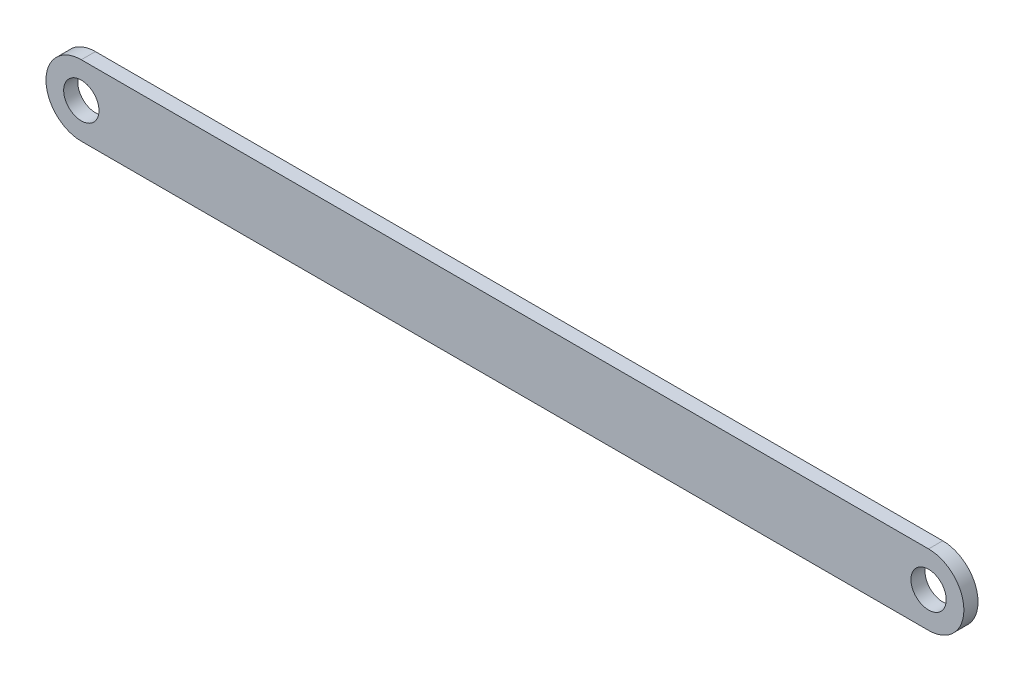
ISO-10303-21;
HEADER;
FILE_DESCRIPTION(('STEP AP214'),'2;1');
FILE_NAME('part.step','',(''),(''),'','','');
FILE_SCHEMA(('AUTOMOTIVE_DESIGN { 1 0 10303 214 1 1 1 1 }'));
ENDSEC;
DATA;
#1=APPLICATION_CONTEXT('core data for automotive mechanical design processes');
#2=APPLICATION_PROTOCOL_DEFINITION('international standard','automotive_design',2000,#1);
#3=PRODUCT_CONTEXT('',#1,'mechanical');
#4=PRODUCT('Part','Part','',(#3));
#5=PRODUCT_RELATED_PRODUCT_CATEGORY('part','',(#4));
#6=PRODUCT_DEFINITION_FORMATION('','',#4);
#7=PRODUCT_DEFINITION_CONTEXT('part definition',#1,'design');
#8=PRODUCT_DEFINITION('design','',#6,#7);
#9=PRODUCT_DEFINITION_SHAPE('','',#8);
#10=(LENGTH_UNIT() NAMED_UNIT(*) SI_UNIT(.MILLI.,.METRE.));
#11=(NAMED_UNIT(*) PLANE_ANGLE_UNIT() SI_UNIT($,.RADIAN.));
#12=(NAMED_UNIT(*) SI_UNIT($,.STERADIAN.) SOLID_ANGLE_UNIT());
#13=UNCERTAINTY_MEASURE_WITH_UNIT(LENGTH_MEASURE(1.E-05),#10,'distance_accuracy_value','');
#14=(GEOMETRIC_REPRESENTATION_CONTEXT(3) GLOBAL_UNCERTAINTY_ASSIGNED_CONTEXT((#13)) GLOBAL_UNIT_ASSIGNED_CONTEXT((#10,
#11,#12)) REPRESENTATION_CONTEXT('',''));
#15=CARTESIAN_POINT('',(0.,0.,0.));
#16=DIRECTION('',(0.,0.,1.));
#17=DIRECTION('',(1.,0.,0.));
#18=AXIS2_PLACEMENT_3D('',#15,#16,#17);
#19=CARTESIAN_POINT('',(-76.2121212121212,5.75757575757577,2.));
#20=DIRECTION('',(0.,0.,1.));
#21=DIRECTION('',(1.,0.,0.));
#22=AXIS2_PLACEMENT_3D('',#19,#20,#21);
#23=PLANE('',#22);
#24=CARTESIAN_POINT('',(-76.2121212121212,5.75757575757577,2.));
#25=DIRECTION('',(0.,0.,1.));
#26=DIRECTION('',(1.,0.,0.));
#27=AXIS2_PLACEMENT_3D('',#24,#25,#26);
#28=CIRCLE('',#27,2.5);
#29=CARTESIAN_POINT('',(-73.7121212121212,5.75757575757577,2.));
#30=VERTEX_POINT('',#29);
#31=EDGE_CURVE('E110',#30,#30,#28,.T.);
#32=ORIENTED_EDGE('',*,*,#31,.F.);
#33=EDGE_LOOP('',(#32));
#34=FACE_BOUND('',#33,.T.);
#35=CARTESIAN_POINT('',(-76.2121212121212,5.75757575757577,2.));
#36=DIRECTION('',(0.,0.,1.));
#37=DIRECTION('',(1.,0.,0.));
#38=AXIS2_PLACEMENT_3D('',#35,#36,#37);
#39=CIRCLE('',#38,5.);
#40=CARTESIAN_POINT('',(-76.2121212121212,10.7575757575758,2.));
#41=VERTEX_POINT('',#40);
#42=CARTESIAN_POINT('',(-76.2121212121212,0.757575757575767,2.));
#43=VERTEX_POINT('',#42);
#44=EDGE_CURVE('E95',#41,#43,#39,.T.);
#45=ORIENTED_EDGE('',*,*,#44,.T.);
#46=DIRECTION('',(1.,0.,0.));
#47=VECTOR('',#46,1.);
#48=CARTESIAN_POINT('',(-76.2121212121212,0.757575757575767,2.));
#49=LINE('',#48,#47);
#50=CARTESIAN_POINT('',(43.7878787878788,0.757575757575765,2.));
#51=VERTEX_POINT('',#50);
#52=EDGE_CURVE('E90',#43,#51,#49,.T.);
#53=ORIENTED_EDGE('',*,*,#52,.T.);
#54=CARTESIAN_POINT('',(43.7878787878788,5.75757575757577,2.));
#55=DIRECTION('',(0.,0.,1.));
#56=DIRECTION('',(1.,0.,0.));
#57=AXIS2_PLACEMENT_3D('',#54,#55,#56);
#58=CIRCLE('',#57,5.);
#59=CARTESIAN_POINT('',(43.7878787878788,10.7575757575758,2.));
#60=VERTEX_POINT('',#59);
#61=EDGE_CURVE('E93',#51,#60,#58,.T.);
#62=ORIENTED_EDGE('',*,*,#61,.T.);
#63=DIRECTION('',(-1.,0.,0.));
#64=VECTOR('',#63,1.);
#65=CARTESIAN_POINT('',(-76.2121212121212,10.7575757575758,2.));
#66=LINE('',#65,#64);
#67=EDGE_CURVE('E60',#60,#41,#66,.T.);
#68=ORIENTED_EDGE('',*,*,#67,.T.);
#69=EDGE_LOOP('',(#45,#53,#62,#68));
#70=FACE_BOUND('',#69,.T.);
#71=CARTESIAN_POINT('',(43.7878787878788,5.75757575757577,2.));
#72=DIRECTION('',(0.,0.,1.));
#73=DIRECTION('',(1.,0.,0.));
#74=AXIS2_PLACEMENT_3D('',#71,#72,#73);
#75=CIRCLE('',#74,2.5);
#76=CARTESIAN_POINT('',(46.2878787878788,5.75757575757577,2.));
#77=VERTEX_POINT('',#76);
#78=EDGE_CURVE('E125',#77,#77,#75,.T.);
#79=ORIENTED_EDGE('',*,*,#78,.F.);
#80=EDGE_LOOP('',(#79));
#81=FACE_BOUND('',#80,.T.);
#82=ADVANCED_FACE('F43',(#34,#70,#81),#23,.T.);
#83=CARTESIAN_POINT('',(-76.2121212121212,5.75757575757577,0.));
#84=DIRECTION('',(0.,0.,1.));
#85=DIRECTION('',(1.,0.,0.));
#86=AXIS2_PLACEMENT_3D('',#83,#84,#85);
#87=PLANE('',#86);
#88=CARTESIAN_POINT('',(-76.2121212121212,5.75757575757577,0.));
#89=DIRECTION('',(0.,0.,1.));
#90=DIRECTION('',(1.,0.,0.));
#91=AXIS2_PLACEMENT_3D('',#88,#89,#90);
#92=CIRCLE('',#91,5.);
#93=CARTESIAN_POINT('',(-76.2121212121212,10.7575757575758,0.));
#94=VERTEX_POINT('',#93);
#95=CARTESIAN_POINT('',(-76.2121212121212,0.757575757575767,0.));
#96=VERTEX_POINT('',#95);
#97=EDGE_CURVE('E107',#94,#96,#92,.T.);
#98=ORIENTED_EDGE('',*,*,#97,.F.);
#99=DIRECTION('',(-1.,0.,0.));
#100=VECTOR('',#99,1.);
#101=CARTESIAN_POINT('',(-76.2121212121212,10.7575757575758,0.));
#102=LINE('',#101,#100);
#103=CARTESIAN_POINT('',(43.7878787878788,10.7575757575758,0.));
#104=VERTEX_POINT('',#103);
#105=EDGE_CURVE('E83',#104,#94,#102,.T.);
#106=ORIENTED_EDGE('',*,*,#105,.F.);
#107=CARTESIAN_POINT('',(43.7878787878788,5.75757575757577,0.));
#108=DIRECTION('',(0.,0.,1.));
#109=DIRECTION('',(1.,0.,0.));
#110=AXIS2_PLACEMENT_3D('',#107,#108,#109);
#111=CIRCLE('',#110,5.);
#112=CARTESIAN_POINT('',(43.7878787878788,0.757575757575765,0.));
#113=VERTEX_POINT('',#112);
#114=EDGE_CURVE('E77',#113,#104,#111,.T.);
#115=ORIENTED_EDGE('',*,*,#114,.F.);
#116=DIRECTION('',(1.,0.,0.));
#117=VECTOR('',#116,1.);
#118=CARTESIAN_POINT('',(-76.2121212121212,0.757575757575767,0.));
#119=LINE('',#118,#117);
#120=EDGE_CURVE('E99',#96,#113,#119,.T.);
#121=ORIENTED_EDGE('',*,*,#120,.F.);
#122=EDGE_LOOP('',(#98,#106,#115,#121));
#123=FACE_BOUND('',#122,.T.);
#124=CARTESIAN_POINT('',(-76.2121212121212,5.75757575757577,0.));
#125=DIRECTION('',(0.,0.,1.));
#126=DIRECTION('',(1.,0.,0.));
#127=AXIS2_PLACEMENT_3D('',#124,#125,#126);
#128=CIRCLE('',#127,2.5);
#129=CARTESIAN_POINT('',(-73.7121212121212,5.75757575757577,0.));
#130=VERTEX_POINT('',#129);
#131=EDGE_CURVE('E122',#130,#130,#128,.T.);
#132=ORIENTED_EDGE('',*,*,#131,.T.);
#133=EDGE_LOOP('',(#132));
#134=FACE_BOUND('',#133,.T.);
#135=CARTESIAN_POINT('',(43.7878787878788,5.75757575757577,0.));
#136=DIRECTION('',(0.,0.,1.));
#137=DIRECTION('',(1.,0.,0.));
#138=AXIS2_PLACEMENT_3D('',#135,#136,#137);
#139=CIRCLE('',#138,2.5);
#140=CARTESIAN_POINT('',(46.2878787878788,5.75757575757577,0.));
#141=VERTEX_POINT('',#140);
#142=EDGE_CURVE('E128',#141,#141,#139,.T.);
#143=ORIENTED_EDGE('',*,*,#142,.T.);
#144=EDGE_LOOP('',(#143));
#145=FACE_BOUND('',#144,.T.);
#146=ADVANCED_FACE('F118',(#123,#134,#145),#87,.F.);
#147=CARTESIAN_POINT('',(-76.2121212121212,5.75757575757577,2.));
#148=DIRECTION('',(0.,0.,-1.));
#149=DIRECTION('',(-1.,0.,0.));
#150=AXIS2_PLACEMENT_3D('',#147,#148,#149);
#151=CYLINDRICAL_SURFACE('',#150,5.);
#152=ORIENTED_EDGE('',*,*,#97,.T.);
#153=DIRECTION('',(0.,0.,-1.));
#154=VECTOR('',#153,1.);
#155=CARTESIAN_POINT('',(-76.2121212121212,0.757575757575767,2.));
#156=LINE('',#155,#154);
#157=EDGE_CURVE('E11',#43,#96,#156,.T.);
#158=ORIENTED_EDGE('',*,*,#157,.F.);
#159=ORIENTED_EDGE('',*,*,#44,.F.);
#160=DIRECTION('',(0.,0.,-1.));
#161=VECTOR('',#160,1.);
#162=CARTESIAN_POINT('',(-76.2121212121212,10.7575757575758,2.));
#163=LINE('',#162,#161);
#164=EDGE_CURVE('E103',#41,#94,#163,.T.);
#165=ORIENTED_EDGE('',*,*,#164,.T.);
#166=EDGE_LOOP('',(#152,#158,#159,#165));
#167=FACE_BOUND('',#166,.T.);
#168=ADVANCED_FACE('F45',(#167),#151,.T.);
#169=CARTESIAN_POINT('',(-76.2121212121212,0.757575757575767,2.));
#170=DIRECTION('',(0.,1.,0.));
#171=DIRECTION('',(0.,0.,1.));
#172=AXIS2_PLACEMENT_3D('',#169,#170,#171);
#173=PLANE('',#172);
#174=ORIENTED_EDGE('',*,*,#120,.T.);
#175=DIRECTION('',(0.,0.,-1.));
#176=VECTOR('',#175,1.);
#177=CARTESIAN_POINT('',(43.7878787878788,0.757575757575765,2.));
#178=LINE('',#177,#176);
#179=EDGE_CURVE('E52',#51,#113,#178,.T.);
#180=ORIENTED_EDGE('',*,*,#179,.F.);
#181=ORIENTED_EDGE('',*,*,#52,.F.);
#182=ORIENTED_EDGE('',*,*,#157,.T.);
#183=EDGE_LOOP('',(#174,#180,#181,#182));
#184=FACE_BOUND('',#183,.T.);
#185=ADVANCED_FACE('F98',(#184),#173,.F.);
#186=CARTESIAN_POINT('',(43.7878787878788,5.75757575757577,2.));
#187=DIRECTION('',(0.,0.,-1.));
#188=DIRECTION('',(-1.,0.,0.));
#189=AXIS2_PLACEMENT_3D('',#186,#187,#188);
#190=CYLINDRICAL_SURFACE('',#189,5.);
#191=ORIENTED_EDGE('',*,*,#114,.T.);
#192=DIRECTION('',(0.,0.,-1.));
#193=VECTOR('',#192,1.);
#194=CARTESIAN_POINT('',(43.7878787878788,10.7575757575758,2.));
#195=LINE('',#194,#193);
#196=EDGE_CURVE('E100',#60,#104,#195,.T.);
#197=ORIENTED_EDGE('',*,*,#196,.F.);
#198=ORIENTED_EDGE('',*,*,#61,.F.);
#199=ORIENTED_EDGE('',*,*,#179,.T.);
#200=EDGE_LOOP('',(#191,#197,#198,#199));
#201=FACE_BOUND('',#200,.T.);
#202=ADVANCED_FACE('F101',(#201),#190,.T.);
#203=CARTESIAN_POINT('',(-76.2121212121212,10.7575757575758,2.));
#204=DIRECTION('',(0.,-1.,0.));
#205=DIRECTION('',(0.,0.,-1.));
#206=AXIS2_PLACEMENT_3D('',#203,#204,#205);
#207=PLANE('',#206);
#208=ORIENTED_EDGE('',*,*,#105,.T.);
#209=ORIENTED_EDGE('',*,*,#164,.F.);
#210=ORIENTED_EDGE('',*,*,#67,.F.);
#211=ORIENTED_EDGE('',*,*,#196,.T.);
#212=EDGE_LOOP('',(#208,#209,#210,#211));
#213=FACE_BOUND('',#212,.T.);
#214=ADVANCED_FACE('F115',(#213),#207,.F.);
#215=CARTESIAN_POINT('',(-76.2121212121212,5.75757575757577,2.));
#216=DIRECTION('',(0.,0.,-1.));
#217=DIRECTION('',(-1.,0.,0.));
#218=AXIS2_PLACEMENT_3D('',#215,#216,#217);
#219=CYLINDRICAL_SURFACE('',#218,2.5);
#220=ORIENTED_EDGE('',*,*,#31,.T.);
#221=EDGE_LOOP('',(#220));
#222=FACE_BOUND('',#221,.T.);
#223=ORIENTED_EDGE('',*,*,#131,.F.);
#224=EDGE_LOOP('',(#223));
#225=FACE_BOUND('',#224,.T.);
#226=ADVANCED_FACE('F145',(#222,#225),#219,.F.);
#227=CARTESIAN_POINT('',(43.7878787878788,5.75757575757577,2.));
#228=DIRECTION('',(0.,0.,-1.));
#229=DIRECTION('',(-1.,0.,0.));
#230=AXIS2_PLACEMENT_3D('',#227,#228,#229);
#231=CYLINDRICAL_SURFACE('',#230,2.5);
#232=ORIENTED_EDGE('',*,*,#78,.T.);
#233=EDGE_LOOP('',(#232));
#234=FACE_BOUND('',#233,.T.);
#235=ORIENTED_EDGE('',*,*,#142,.F.);
#236=EDGE_LOOP('',(#235));
#237=FACE_BOUND('',#236,.T.);
#238=ADVANCED_FACE('F134',(#234,#237),#231,.F.);
#239=CLOSED_SHELL('',(#82,#146,#168,#185,#202,#214,#226,#238));
#240=MANIFOLD_SOLID_BREP('B2',#239);
#241=ADVANCED_BREP_SHAPE_REPRESENTATION('',(#18,#240),#14);
#242=SHAPE_DEFINITION_REPRESENTATION(#9,#241);
ENDSEC;
END-ISO-10303-21;
